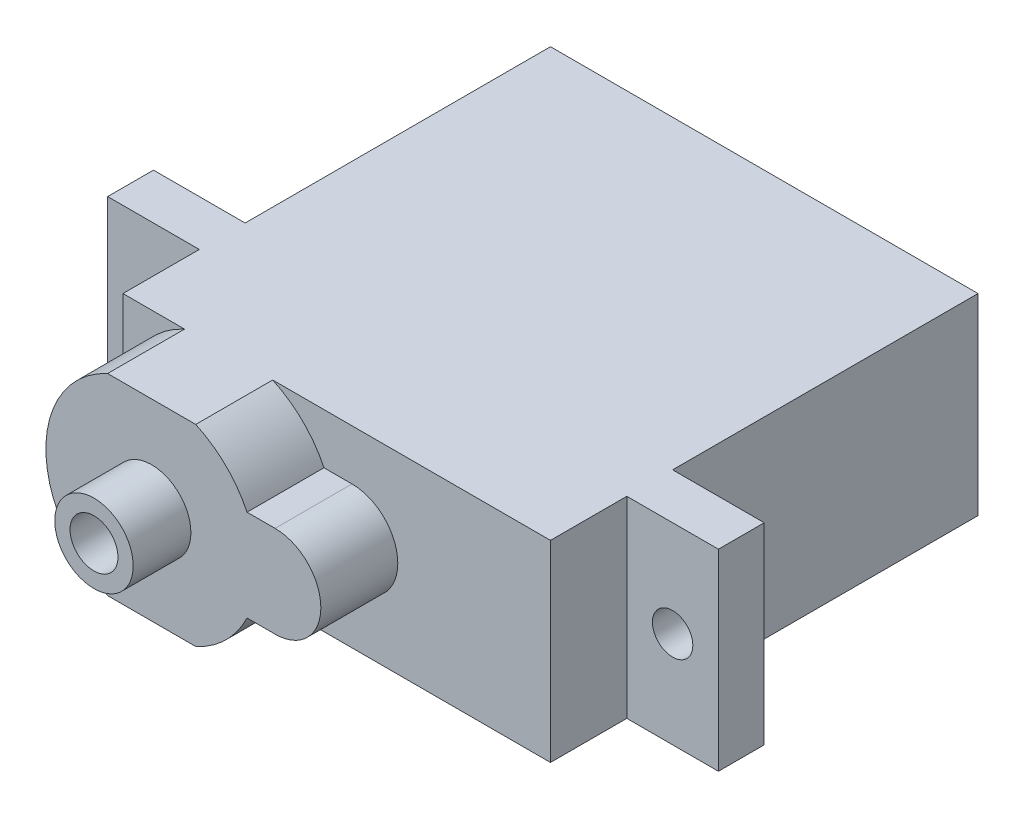
ISO-10303-21;
HEADER;
FILE_DESCRIPTION(('STEP AP214'),'2;1');
FILE_NAME('part.step','',(''),(''),'','','');
FILE_SCHEMA(('AUTOMOTIVE_DESIGN { 1 0 10303 214 1 1 1 1 }'));
ENDSEC;
DATA;
#1=APPLICATION_CONTEXT('core data for automotive mechanical design processes');
#2=APPLICATION_PROTOCOL_DEFINITION('international standard','automotive_design',2000,#1);
#3=PRODUCT_CONTEXT('',#1,'mechanical');
#4=PRODUCT('Part','Part','',(#3));
#5=PRODUCT_RELATED_PRODUCT_CATEGORY('part','',(#4));
#6=PRODUCT_DEFINITION_FORMATION('','',#4);
#7=PRODUCT_DEFINITION_CONTEXT('part definition',#1,'design');
#8=PRODUCT_DEFINITION('design','',#6,#7);
#9=PRODUCT_DEFINITION_SHAPE('','',#8);
#10=(LENGTH_UNIT() NAMED_UNIT(*) SI_UNIT(.MILLI.,.METRE.));
#11=(NAMED_UNIT(*) PLANE_ANGLE_UNIT() SI_UNIT($,.RADIAN.));
#12=(NAMED_UNIT(*) SI_UNIT($,.STERADIAN.) SOLID_ANGLE_UNIT());
#13=UNCERTAINTY_MEASURE_WITH_UNIT(LENGTH_MEASURE(1.E-05),#10,'distance_accuracy_value','');
#14=(GEOMETRIC_REPRESENTATION_CONTEXT(3) GLOBAL_UNCERTAINTY_ASSIGNED_CONTEXT((#13)) GLOBAL_UNIT_ASSIGNED_CONTEXT((#10,
#11,#12)) REPRESENTATION_CONTEXT('',''));
#15=CARTESIAN_POINT('',(0.,0.,0.));
#16=DIRECTION('',(0.,0.,1.));
#17=DIRECTION('',(1.,0.,0.));
#18=AXIS2_PLACEMENT_3D('',#15,#16,#17);
#19=CARTESIAN_POINT('',(1.15186357194197,-1.67093684812876E-06,122.982558594889));
#20=DIRECTION('',(0.,0.,1.));
#21=DIRECTION('',(1.,0.,0.));
#22=AXIS2_PLACEMENT_3D('',#19,#20,#21);
#23=PLANE('',#22);
#24=DIRECTION('',(-1.,0.,0.));
#25=VECTOR('',#24,1.);
#26=CARTESIAN_POINT('',(1.15186357194197,-19.0500541629293,122.982558594889));
#27=LINE('',#26,#25);
#28=CARTESIAN_POINT('',(9.23615171911756,-19.0500541629293,122.982558594889));
#29=VERTEX_POINT('',#28);
#30=CARTESIAN_POINT('',(-2.40171534908267,-19.0500541629293,122.982558594889));
#31=VERTEX_POINT('',#30);
#32=EDGE_CURVE('E200',#29,#31,#27,.T.);
#33=ORIENTED_EDGE('',*,*,#32,.F.);
#34=CARTESIAN_POINT('',(9.23615171911736,0.000292086948433482,122.982558594889));
#35=DIRECTION('',(0.,0.,1.));
#36=DIRECTION('',(1.,0.,0.));
#37=AXIS2_PLACEMENT_3D('',#34,#35,#36);
#38=CIRCLE('',#37,19.0503462459962);
#39=CARTESIAN_POINT('',(9.23669557194196,19.0506383290632,122.982558594889));
#40=VERTEX_POINT('',#39);
#41=EDGE_CURVE('E208',#29,#40,#38,.T.);
#42=ORIENTED_EDGE('',*,*,#41,.T.);
#43=DIRECTION('',(-1.,0.,0.));
#44=VECTOR('',#43,1.);
#45=CARTESIAN_POINT('',(1.15186357194197,19.0506383290632,122.982558594889));
#46=LINE('',#45,#44);
#47=CARTESIAN_POINT('',(-2.40199753846205,19.0506383290632,122.982558594889));
#48=VERTEX_POINT('',#47);
#49=EDGE_CURVE('E214',#40,#48,#46,.T.);
#50=ORIENTED_EDGE('',*,*,#49,.T.);
#51=CARTESIAN_POINT('',(-42.0639833131355,-1.67093684812876E-06,122.982558594889));
#52=DIRECTION('',(0.,0.,1.));
#53=DIRECTION('',(1.,0.,0.));
#54=AXIS2_PLACEMENT_3D('',#51,#52,#53);
#55=CIRCLE('',#54,44.);
#56=CARTESIAN_POINT('',(-23.7336805333122,39.9999983290632,122.982558594889));
#57=VERTEX_POINT('',#56);
#58=EDGE_CURVE('E233',#48,#57,#55,.T.);
#59=ORIENTED_EDGE('',*,*,#58,.T.);
#60=DIRECTION('',(-1.,0.,0.));
#61=VECTOR('',#60,1.);
#62=CARTESIAN_POINT('',(1.15186357194197,39.9999983290632,122.982558594889));
#63=LINE('',#62,#61);
#64=CARTESIAN_POINT('',(-60.3942860929589,39.9999983290632,122.982558594889));
#65=VERTEX_POINT('',#64);
#66=EDGE_CURVE('E236',#57,#65,#63,.T.);
#67=ORIENTED_EDGE('',*,*,#66,.T.);
#68=CARTESIAN_POINT('',(-86.013336428058,2.11053399089171,122.982558594889));
#69=VERTEX_POINT('',#68);
#70=EDGE_CURVE('E237',#65,#69,#55,.T.);
#71=ORIENTED_EDGE('',*,*,#70,.T.);
#72=DIRECTION('',(0.,-1.,0.));
#73=VECTOR('',#72,1.);
#74=CARTESIAN_POINT('',(-86.013336428058,-1.67093684812876E-06,122.982558594889));
#75=LINE('',#74,#73);
#76=CARTESIAN_POINT('',(-86.013336428058,-2.1105373327654,122.982558594889));
#77=VERTEX_POINT('',#76);
#78=EDGE_CURVE('E240',#69,#77,#75,.T.);
#79=ORIENTED_EDGE('',*,*,#78,.T.);
#80=CARTESIAN_POINT('',(-60.3942860929589,-40.0000016709368,122.982558594889));
#81=VERTEX_POINT('',#80);
#82=EDGE_CURVE('E243',#77,#81,#55,.T.);
#83=ORIENTED_EDGE('',*,*,#82,.T.);
#84=DIRECTION('',(1.,0.,0.));
#85=VECTOR('',#84,1.);
#86=CARTESIAN_POINT('',(1.15186357194197,-40.0000016709368,122.982558594889));
#87=LINE('',#86,#85);
#88=CARTESIAN_POINT('',(-23.7336805333122,-40.0000016709368,122.982558594889));
#89=VERTEX_POINT('',#88);
#90=EDGE_CURVE('E244',#81,#89,#87,.T.);
#91=ORIENTED_EDGE('',*,*,#90,.T.);
#92=EDGE_CURVE('E218',#89,#31,#55,.T.);
#93=ORIENTED_EDGE('',*,*,#92,.T.);
#94=EDGE_LOOP('',(#33,#42,#50,#59,#67,#71,#79,#83,#91,#93));
#95=FACE_BOUND('',#94,.T.);
#96=CARTESIAN_POINT('',(-42.0639833131355,-1.67093684812876E-06,122.982558594889));
#97=DIRECTION('',(0.,0.,1.));
#98=DIRECTION('',(1.,0.,0.));
#99=AXIS2_PLACEMENT_3D('',#96,#97,#98);
#100=CIRCLE('',#99,16.3106998418424);
#101=CARTESIAN_POINT('',(-25.7532834712931,-1.67093684812876E-06,122.982558594889));
#102=VERTEX_POINT('',#101);
#103=EDGE_CURVE('E228',#102,#102,#100,.T.);
#104=ORIENTED_EDGE('',*,*,#103,.F.);
#105=EDGE_LOOP('',(#104));
#106=FACE_BOUND('',#105,.T.);
#107=ADVANCED_FACE('F47',(#95,#106),#23,.T.);
#108=CARTESIAN_POINT('',(91.786663571942,39.9999983290632,90.9825585948885));
#109=DIRECTION('',(0.,0.,-1.));
#110=DIRECTION('',(-1.,0.,0.));
#111=AXIS2_PLACEMENT_3D('',#108,#109,#110);
#112=PLANE('',#111);
#113=CARTESIAN_POINT('',(-42.0639833131355,-1.67093684812876E-06,90.9825585948885));
#114=DIRECTION('',(0.,0.,1.));
#115=DIRECTION('',(1.,0.,0.));
#116=AXIS2_PLACEMENT_3D('',#113,#114,#115);
#117=CIRCLE('',#116,44.);
#118=CARTESIAN_POINT('',(-86.013336428058,-2.1105373327654,90.9825585948885));
#119=VERTEX_POINT('',#118);
#120=CARTESIAN_POINT('',(-60.3942860929589,-40.0000016709368,90.9825585948885));
#121=VERTEX_POINT('',#120);
#122=EDGE_CURVE('E225',#119,#121,#117,.T.);
#123=ORIENTED_EDGE('',*,*,#122,.F.);
#124=DIRECTION('',(0.,-1.,0.));
#125=VECTOR('',#124,1.);
#126=CARTESIAN_POINT('',(-86.013336428058,39.9999983290632,90.9825585948885));
#127=LINE('',#126,#125);
#128=CARTESIAN_POINT('',(-86.013336428058,-40.0000016709368,90.9825585948885));
#129=VERTEX_POINT('',#128);
#130=EDGE_CURVE('E400',#119,#129,#127,.T.);
#131=ORIENTED_EDGE('',*,*,#130,.T.);
#132=DIRECTION('',(1.,0.,0.));
#133=VECTOR('',#132,1.);
#134=CARTESIAN_POINT('',(91.786663571942,-40.0000016709368,90.9825585948885));
#135=LINE('',#134,#133);
#136=EDGE_CURVE('E360',#129,#121,#135,.T.);
#137=ORIENTED_EDGE('',*,*,#136,.T.);
#138=EDGE_LOOP('',(#123,#131,#137));
#139=FACE_BOUND('',#138,.T.);
#140=ADVANCED_FACE('F418',(#139),#112,.F.);
#141=CARTESIAN_POINT('',(-60.3942860929589,39.9999983290632,90.9825585948885));
#142=VERTEX_POINT('',#141);
#143=CARTESIAN_POINT('',(-86.013336428058,2.11053399089171,90.9825585948885));
#144=VERTEX_POINT('',#143);
#145=EDGE_CURVE('E274',#142,#144,#117,.T.);
#146=ORIENTED_EDGE('',*,*,#145,.F.);
#147=DIRECTION('',(1.,0.,0.));
#148=VECTOR('',#147,1.);
#149=CARTESIAN_POINT('',(91.786663571942,39.9999983290632,90.9825585948885));
#150=LINE('',#149,#148);
#151=CARTESIAN_POINT('',(-86.013336428058,39.9999983290632,90.9825585948885));
#152=VERTEX_POINT('',#151);
#153=EDGE_CURVE('E352',#152,#142,#150,.T.);
#154=ORIENTED_EDGE('',*,*,#153,.F.);
#155=EDGE_CURVE('E406',#152,#144,#127,.T.);
#156=ORIENTED_EDGE('',*,*,#155,.T.);
#157=EDGE_LOOP('',(#146,#154,#156));
#158=FACE_BOUND('',#157,.T.);
#159=ADVANCED_FACE('F523',(#158),#112,.F.);
#160=CARTESIAN_POINT('',(-23.7336805333122,-40.0000016709368,90.9825585948885));
#161=VERTEX_POINT('',#160);
#162=CARTESIAN_POINT('',(-2.40171534908267,-19.0500541629293,90.9825585948885));
#163=VERTEX_POINT('',#162);
#164=EDGE_CURVE('E221',#161,#163,#117,.T.);
#165=ORIENTED_EDGE('',*,*,#164,.F.);
#166=CARTESIAN_POINT('',(91.786663571942,-40.0000016709368,90.9825585948885));
#167=VERTEX_POINT('',#166);
#168=EDGE_CURVE('E356',#161,#167,#135,.T.);
#169=ORIENTED_EDGE('',*,*,#168,.T.);
#170=DIRECTION('',(0.,-1.,0.));
#171=VECTOR('',#170,1.);
#172=CARTESIAN_POINT('',(91.786663571942,39.9999983290632,90.9825585948885));
#173=LINE('',#172,#171);
#174=CARTESIAN_POINT('',(91.786663571942,39.9999983290632,90.9825585948885));
#175=VERTEX_POINT('',#174);
#176=EDGE_CURVE('E396',#175,#167,#173,.T.);
#177=ORIENTED_EDGE('',*,*,#176,.F.);
#178=CARTESIAN_POINT('',(-23.7336805333122,39.9999983290632,90.9825585948885));
#179=VERTEX_POINT('',#178);
#180=EDGE_CURVE('E343',#179,#175,#150,.T.);
#181=ORIENTED_EDGE('',*,*,#180,.F.);
#182=CARTESIAN_POINT('',(-2.40199753846205,19.0506383290632,90.9825585948885));
#183=VERTEX_POINT('',#182);
#184=EDGE_CURVE('E70',#183,#179,#117,.T.);
#185=ORIENTED_EDGE('',*,*,#184,.F.);
#186=DIRECTION('',(-1.,0.,0.));
#187=VECTOR('',#186,1.);
#188=CARTESIAN_POINT('',(1.15186357194197,19.0506383290632,90.9825585948885));
#189=LINE('',#188,#187);
#190=CARTESIAN_POINT('',(9.23669557194196,19.0506383290632,90.9825585948885));
#191=VERTEX_POINT('',#190);
#192=EDGE_CURVE('E253',#191,#183,#189,.T.);
#193=ORIENTED_EDGE('',*,*,#192,.F.);
#194=CARTESIAN_POINT('',(9.23615171911736,0.000292086948433482,90.9825585948885));
#195=DIRECTION('',(0.,0.,1.));
#196=DIRECTION('',(1.,0.,0.));
#197=AXIS2_PLACEMENT_3D('',#194,#195,#196);
#198=CIRCLE('',#197,19.0503462459962);
#199=CARTESIAN_POINT('',(9.23615171911756,-19.0500541629293,90.9825585948885));
#200=VERTEX_POINT('',#199);
#201=EDGE_CURVE('E249',#200,#191,#198,.T.);
#202=ORIENTED_EDGE('',*,*,#201,.F.);
#203=DIRECTION('',(-1.,0.,0.));
#204=VECTOR('',#203,1.);
#205=CARTESIAN_POINT('',(1.15186357194197,-19.0500541629293,90.9825585948885));
#206=LINE('',#205,#204);
#207=EDGE_CURVE('E63',#200,#163,#206,.T.);
#208=ORIENTED_EDGE('',*,*,#207,.T.);
#209=EDGE_LOOP('',(#165,#169,#177,#181,#185,#193,#202,#208));
#210=FACE_BOUND('',#209,.T.);
#211=ADVANCED_FACE('F536',(#210),#112,.F.);
#212=CARTESIAN_POINT('',(91.786663571942,39.9999983290632,-86.8174414051115));
#213=DIRECTION('',(-1.,0.,0.));
#214=DIRECTION('',(0.,0.,1.));
#215=AXIS2_PLACEMENT_3D('',#212,#213,#214);
#216=PLANE('',#215);
#217=DIRECTION('',(0.,0.,-1.));
#218=VECTOR('',#217,1.);
#219=CARTESIAN_POINT('',(91.786663571942,-40.0000016709368,-86.8174414051115));
#220=LINE('',#219,#218);
#221=CARTESIAN_POINT('',(91.786663571942,-40.0000016709368,40.1825585948884));
#222=VERTEX_POINT('',#221);
#223=CARTESIAN_POINT('',(91.786663571942,-40.0000016709368,-86.8174414051115));
#224=VERTEX_POINT('',#223);
#225=EDGE_CURVE('E204',#222,#224,#220,.T.);
#226=ORIENTED_EDGE('',*,*,#225,.T.);
#227=DIRECTION('',(0.,-1.,0.));
#228=VECTOR('',#227,1.);
#229=CARTESIAN_POINT('',(91.786663571942,39.9999983290632,-86.8174414051115));
#230=LINE('',#229,#228);
#231=CARTESIAN_POINT('',(91.786663571942,39.9999983290632,-86.8174414051115));
#232=VERTEX_POINT('',#231);
#233=EDGE_CURVE('E56',#232,#224,#230,.T.);
#234=ORIENTED_EDGE('',*,*,#233,.F.);
#235=DIRECTION('',(0.,0.,-1.));
#236=VECTOR('',#235,1.);
#237=CARTESIAN_POINT('',(91.786663571942,39.9999983290632,-86.8174414051115));
#238=LINE('',#237,#236);
#239=CARTESIAN_POINT('',(91.786663571942,39.9999983290632,40.1825585948884));
#240=VERTEX_POINT('',#239);
#241=EDGE_CURVE('E320',#240,#232,#238,.T.);
#242=ORIENTED_EDGE('',*,*,#241,.F.);
#243=DIRECTION('',(0.,-1.,0.));
#244=VECTOR('',#243,1.);
#245=CARTESIAN_POINT('',(91.786663571942,39.9999983290632,40.1825585948884));
#246=LINE('',#245,#244);
#247=EDGE_CURVE('E379',#240,#222,#246,.T.);
#248=ORIENTED_EDGE('',*,*,#247,.T.);
#249=EDGE_LOOP('',(#226,#234,#242,#248));
#250=FACE_BOUND('',#249,.T.);
#251=ADVANCED_FACE('F49',(#250),#216,.F.);
#252=CARTESIAN_POINT('',(-86.013336428058,39.9999983290632,-86.8174414051115));
#253=DIRECTION('',(0.,0.,1.));
#254=DIRECTION('',(1.,0.,0.));
#255=AXIS2_PLACEMENT_3D('',#252,#253,#254);
#256=PLANE('',#255);
#257=DIRECTION('',(-1.,0.,0.));
#258=VECTOR('',#257,1.);
#259=CARTESIAN_POINT('',(-86.013336428058,-40.0000016709368,-86.8174414051115));
#260=LINE('',#259,#258);
#261=CARTESIAN_POINT('',(-86.013336428058,-40.0000016709368,-86.8174414051115));
#262=VERTEX_POINT('',#261);
#263=EDGE_CURVE('E445',#224,#262,#260,.T.);
#264=ORIENTED_EDGE('',*,*,#263,.T.);
#265=DIRECTION('',(0.,-1.,0.));
#266=VECTOR('',#265,1.);
#267=CARTESIAN_POINT('',(-86.013336428058,39.9999983290632,-86.8174414051115));
#268=LINE('',#267,#266);
#269=CARTESIAN_POINT('',(-86.013336428058,39.9999983290632,-86.8174414051115));
#270=VERTEX_POINT('',#269);
#271=EDGE_CURVE('E487',#270,#262,#268,.T.);
#272=ORIENTED_EDGE('',*,*,#271,.F.);
#273=DIRECTION('',(-1.,0.,0.));
#274=VECTOR('',#273,1.);
#275=CARTESIAN_POINT('',(-86.013336428058,39.9999983290632,-86.8174414051115));
#276=LINE('',#275,#274);
#277=EDGE_CURVE('E324',#232,#270,#276,.T.);
#278=ORIENTED_EDGE('',*,*,#277,.F.);
#279=ORIENTED_EDGE('',*,*,#233,.T.);
#280=EDGE_LOOP('',(#264,#272,#278,#279));
#281=FACE_BOUND('',#280,.T.);
#282=ADVANCED_FACE('F520',(#281),#256,.F.);
#283=CARTESIAN_POINT('',(-86.013336428058,39.9999983290632,40.1825585948885));
#284=DIRECTION('',(1.,0.,0.));
#285=DIRECTION('',(0.,0.,-1.));
#286=AXIS2_PLACEMENT_3D('',#283,#284,#285);
#287=PLANE('',#286);
#288=DIRECTION('',(0.,0.,1.));
#289=VECTOR('',#288,1.);
#290=CARTESIAN_POINT('',(-86.013336428058,-40.0000016709368,40.1825585948885));
#291=LINE('',#290,#289);
#292=CARTESIAN_POINT('',(-86.013336428058,-40.0000016709368,40.1825585948885));
#293=VERTEX_POINT('',#292);
#294=EDGE_CURVE('E442',#262,#293,#291,.T.);
#295=ORIENTED_EDGE('',*,*,#294,.T.);
#296=DIRECTION('',(0.,-1.,0.));
#297=VECTOR('',#296,1.);
#298=CARTESIAN_POINT('',(-86.013336428058,39.9999983290632,40.1825585948885));
#299=LINE('',#298,#297);
#300=CARTESIAN_POINT('',(-86.013336428058,39.9999983290632,40.1825585948885));
#301=VERTEX_POINT('',#300);
#302=EDGE_CURVE('E490',#301,#293,#299,.T.);
#303=ORIENTED_EDGE('',*,*,#302,.F.);
#304=DIRECTION('',(0.,0.,1.));
#305=VECTOR('',#304,1.);
#306=CARTESIAN_POINT('',(-86.013336428058,39.9999983290632,40.1825585948885));
#307=LINE('',#306,#305);
#308=EDGE_CURVE('E328',#270,#301,#307,.T.);
#309=ORIENTED_EDGE('',*,*,#308,.F.);
#310=ORIENTED_EDGE('',*,*,#271,.T.);
#311=EDGE_LOOP('',(#295,#303,#309,#310));
#312=FACE_BOUND('',#311,.T.);
#313=ADVANCED_FACE('F518',(#312),#287,.F.);
#314=CARTESIAN_POINT('',(-124.113336428058,39.9999983290632,40.1825585948885));
#315=DIRECTION('',(0.,0.,1.));
#316=DIRECTION('',(1.,0.,0.));
#317=AXIS2_PLACEMENT_3D('',#314,#315,#316);
#318=PLANE('',#317);
#319=CARTESIAN_POINT('',(-105.06363684376,0.000466795578882427,40.1825585948885));
#320=DIRECTION('',(0.,0.,1.));
#321=DIRECTION('',(1.,0.,0.));
#322=AXIS2_PLACEMENT_3D('',#319,#320,#321);
#323=CIRCLE('',#322,8.4);
#324=CARTESIAN_POINT('',(-96.6636368437603,0.000466795578882427,40.1825585948885));
#325=VERTEX_POINT('',#324);
#326=EDGE_CURVE('E548',#325,#325,#323,.F.);
#327=ORIENTED_EDGE('',*,*,#326,.F.);
#328=EDGE_LOOP('',(#327));
#329=FACE_BOUND('',#328,.T.);
#330=DIRECTION('',(-1.,0.,0.));
#331=VECTOR('',#330,1.);
#332=CARTESIAN_POINT('',(-124.113336428058,-40.0000016709368,40.1825585948885));
#333=LINE('',#332,#331);
#334=CARTESIAN_POINT('',(-124.113336428058,-40.0000016709368,40.1825585948885));
#335=VERTEX_POINT('',#334);
#336=EDGE_CURVE('E439',#293,#335,#333,.T.);
#337=ORIENTED_EDGE('',*,*,#336,.T.);
#338=DIRECTION('',(0.,-1.,0.));
#339=VECTOR('',#338,1.);
#340=CARTESIAN_POINT('',(-124.113336428058,39.9999983290632,40.1825585948885));
#341=LINE('',#340,#339);
#342=CARTESIAN_POINT('',(-124.113336428058,39.9999983290632,40.1825585948885));
#343=VERTEX_POINT('',#342);
#344=EDGE_CURVE('E496',#343,#335,#341,.T.);
#345=ORIENTED_EDGE('',*,*,#344,.F.);
#346=DIRECTION('',(-1.,0.,0.));
#347=VECTOR('',#346,1.);
#348=CARTESIAN_POINT('',(-124.113336428058,39.9999983290632,40.1825585948885));
#349=LINE('',#348,#347);
#350=EDGE_CURVE('E331',#301,#343,#349,.T.);
#351=ORIENTED_EDGE('',*,*,#350,.F.);
#352=ORIENTED_EDGE('',*,*,#302,.T.);
#353=EDGE_LOOP('',(#337,#345,#351,#352));
#354=FACE_BOUND('',#353,.T.);
#355=ADVANCED_FACE('F514',(#329,#354),#318,.F.);
#356=CARTESIAN_POINT('',(-124.113336428058,39.9999983290632,59.2325585948885));
#357=DIRECTION('',(1.,0.,0.));
#358=DIRECTION('',(0.,0.,-1.));
#359=AXIS2_PLACEMENT_3D('',#356,#357,#358);
#360=PLANE('',#359);
#361=DIRECTION('',(0.,0.,1.));
#362=VECTOR('',#361,1.);
#363=CARTESIAN_POINT('',(-124.113336428058,-40.0000016709368,59.2325585948885));
#364=LINE('',#363,#362);
#365=CARTESIAN_POINT('',(-124.113336428058,-40.0000016709368,59.2325585948885));
#366=VERTEX_POINT('',#365);
#367=EDGE_CURVE('E437',#335,#366,#364,.T.);
#368=ORIENTED_EDGE('',*,*,#367,.T.);
#369=DIRECTION('',(0.,-1.,0.));
#370=VECTOR('',#369,1.);
#371=CARTESIAN_POINT('',(-124.113336428058,39.9999983290632,59.2325585948885));
#372=LINE('',#371,#370);
#373=CARTESIAN_POINT('',(-124.113336428058,39.9999983290632,59.2325585948885));
#374=VERTEX_POINT('',#373);
#375=EDGE_CURVE('E414',#374,#366,#372,.T.);
#376=ORIENTED_EDGE('',*,*,#375,.F.);
#377=DIRECTION('',(0.,0.,1.));
#378=VECTOR('',#377,1.);
#379=CARTESIAN_POINT('',(-124.113336428058,39.9999983290632,59.2325585948885));
#380=LINE('',#379,#378);
#381=EDGE_CURVE('E334',#343,#374,#380,.T.);
#382=ORIENTED_EDGE('',*,*,#381,.F.);
#383=ORIENTED_EDGE('',*,*,#344,.T.);
#384=EDGE_LOOP('',(#368,#376,#382,#383));
#385=FACE_BOUND('',#384,.T.);
#386=ADVANCED_FACE('F510',(#385),#360,.F.);
#387=CARTESIAN_POINT('',(-86.013336428058,39.9999983290632,59.2325585948885));
#388=DIRECTION('',(0.,0.,-1.));
#389=DIRECTION('',(-1.,0.,0.));
#390=AXIS2_PLACEMENT_3D('',#387,#388,#389);
#391=PLANE('',#390);
#392=CARTESIAN_POINT('',(-105.06363684376,0.000466795578882427,59.2325585948885));
#393=DIRECTION('',(0.,0.,1.));
#394=DIRECTION('',(1.,0.,0.));
#395=AXIS2_PLACEMENT_3D('',#392,#393,#394);
#396=CIRCLE('',#395,8.4);
#397=CARTESIAN_POINT('',(-96.6636368437603,0.000466795578882427,59.2325585948885));
#398=VERTEX_POINT('',#397);
#399=EDGE_CURVE('E552',#398,#398,#396,.T.);
#400=ORIENTED_EDGE('',*,*,#399,.F.);
#401=EDGE_LOOP('',(#400));
#402=FACE_BOUND('',#401,.T.);
#403=DIRECTION('',(1.,0.,0.));
#404=VECTOR('',#403,1.);
#405=CARTESIAN_POINT('',(-86.013336428058,-40.0000016709368,59.2325585948885));
#406=LINE('',#405,#404);
#407=CARTESIAN_POINT('',(-86.013336428058,-40.0000016709368,59.2325585948885));
#408=VERTEX_POINT('',#407);
#409=EDGE_CURVE('E429',#366,#408,#406,.T.);
#410=ORIENTED_EDGE('',*,*,#409,.T.);
#411=DIRECTION('',(0.,-1.,0.));
#412=VECTOR('',#411,1.);
#413=CARTESIAN_POINT('',(-86.013336428058,39.9999983290632,59.2325585948885));
#414=LINE('',#413,#412);
#415=CARTESIAN_POINT('',(-86.013336428058,39.9999983290632,59.2325585948885));
#416=VERTEX_POINT('',#415);
#417=EDGE_CURVE('E403',#416,#408,#414,.T.);
#418=ORIENTED_EDGE('',*,*,#417,.F.);
#419=DIRECTION('',(1.,0.,0.));
#420=VECTOR('',#419,1.);
#421=CARTESIAN_POINT('',(-86.013336428058,39.9999983290632,59.2325585948885));
#422=LINE('',#421,#420);
#423=EDGE_CURVE('E337',#374,#416,#422,.T.);
#424=ORIENTED_EDGE('',*,*,#423,.F.);
#425=ORIENTED_EDGE('',*,*,#375,.T.);
#426=EDGE_LOOP('',(#410,#418,#424,#425));
#427=FACE_BOUND('',#426,.T.);
#428=ADVANCED_FACE('F504',(#402,#427),#391,.F.);
#429=CARTESIAN_POINT('',(-86.013336428058,39.9999983290632,90.9825585948885));
#430=DIRECTION('',(1.,0.,0.));
#431=DIRECTION('',(0.,0.,-1.));
#432=AXIS2_PLACEMENT_3D('',#429,#430,#431);
#433=PLANE('',#432);
#434=DIRECTION('',(0.,0.,1.));
#435=VECTOR('',#434,1.);
#436=CARTESIAN_POINT('',(-86.013336428058,-40.0000016709368,90.9825585948885));
#437=LINE('',#436,#435);
#438=EDGE_CURVE('E361',#408,#129,#437,.T.);
#439=ORIENTED_EDGE('',*,*,#438,.T.);
#440=ORIENTED_EDGE('',*,*,#130,.F.);
#441=DIRECTION('',(0.,0.,-1.));
#442=VECTOR('',#441,1.);
#443=CARTESIAN_POINT('',(-86.013336428058,-2.1105373327654,122.982558594889));
#444=LINE('',#443,#442);
#445=EDGE_CURVE('E280',#77,#119,#444,.T.);
#446=ORIENTED_EDGE('',*,*,#445,.F.);
#447=ORIENTED_EDGE('',*,*,#78,.F.);
#448=DIRECTION('',(0.,0.,-1.));
#449=VECTOR('',#448,1.);
#450=CARTESIAN_POINT('',(-86.013336428058,2.11053399089171,122.982558594889));
#451=LINE('',#450,#449);
#452=EDGE_CURVE('E287',#69,#144,#451,.T.);
#453=ORIENTED_EDGE('',*,*,#452,.T.);
#454=ORIENTED_EDGE('',*,*,#155,.F.);
#455=DIRECTION('',(0.,0.,1.));
#456=VECTOR('',#455,1.);
#457=CARTESIAN_POINT('',(-86.013336428058,39.9999983290632,90.9825585948885));
#458=LINE('',#457,#456);
#459=EDGE_CURVE('E340',#416,#152,#458,.T.);
#460=ORIENTED_EDGE('',*,*,#459,.F.);
#461=ORIENTED_EDGE('',*,*,#417,.T.);
#462=EDGE_LOOP('',(#439,#440,#446,#447,#453,#454,#460,#461));
#463=FACE_BOUND('',#462,.T.);
#464=ADVANCED_FACE('F423',(#463),#433,.F.);
#465=CARTESIAN_POINT('',(91.786663571942,39.9999983290632,59.2325585948885));
#466=DIRECTION('',(-1.,0.,0.));
#467=DIRECTION('',(0.,0.,1.));
#468=AXIS2_PLACEMENT_3D('',#465,#466,#467);
#469=PLANE('',#468);
#470=DIRECTION('',(0.,0.,-1.));
#471=VECTOR('',#470,1.);
#472=CARTESIAN_POINT('',(91.786663571942,-40.0000016709368,59.2325585948885));
#473=LINE('',#472,#471);
#474=CARTESIAN_POINT('',(91.786663571942,-40.0000016709368,59.2325585948885));
#475=VERTEX_POINT('',#474);
#476=EDGE_CURVE('E367',#167,#475,#473,.T.);
#477=ORIENTED_EDGE('',*,*,#476,.T.);
#478=DIRECTION('',(0.,-1.,0.));
#479=VECTOR('',#478,1.);
#480=CARTESIAN_POINT('',(91.786663571942,39.9999983290632,59.2325585948885));
#481=LINE('',#480,#479);
#482=CARTESIAN_POINT('',(91.786663571942,39.9999983290632,59.2325585948885));
#483=VERTEX_POINT('',#482);
#484=EDGE_CURVE('E392',#483,#475,#481,.T.);
#485=ORIENTED_EDGE('',*,*,#484,.F.);
#486=DIRECTION('',(0.,0.,-1.));
#487=VECTOR('',#486,1.);
#488=CARTESIAN_POINT('',(91.786663571942,39.9999983290632,59.2325585948885));
#489=LINE('',#488,#487);
#490=EDGE_CURVE('E346',#175,#483,#489,.T.);
#491=ORIENTED_EDGE('',*,*,#490,.F.);
#492=ORIENTED_EDGE('',*,*,#176,.T.);
#493=EDGE_LOOP('',(#477,#485,#491,#492));
#494=FACE_BOUND('',#493,.T.);
#495=ADVANCED_FACE('F468',(#494),#469,.F.);
#496=CARTESIAN_POINT('',(129.886663571942,39.9999983290632,59.2325585948885));
#497=DIRECTION('',(0.,0.,-1.));
#498=DIRECTION('',(-1.,0.,0.));
#499=AXIS2_PLACEMENT_3D('',#496,#497,#498);
#500=PLANE('',#499);
#501=CARTESIAN_POINT('',(110.836156215017,0.000489650266029676,59.2325585948885));
#502=DIRECTION('',(0.,0.,1.));
#503=DIRECTION('',(1.,0.,0.));
#504=AXIS2_PLACEMENT_3D('',#501,#502,#503);
#505=CIRCLE('',#504,8.39999999999996);
#506=CARTESIAN_POINT('',(119.236156215017,0.000489650266029676,59.2325585948885));
#507=VERTEX_POINT('',#506);
#508=EDGE_CURVE('E560',#507,#507,#505,.T.);
#509=ORIENTED_EDGE('',*,*,#508,.F.);
#510=EDGE_LOOP('',(#509));
#511=FACE_BOUND('',#510,.T.);
#512=DIRECTION('',(1.,0.,0.));
#513=VECTOR('',#512,1.);
#514=CARTESIAN_POINT('',(129.886663571942,-40.0000016709368,59.2325585948885));
#515=LINE('',#514,#513);
#516=CARTESIAN_POINT('',(129.886663571942,-40.0000016709368,59.2325585948885));
#517=VERTEX_POINT('',#516);
#518=EDGE_CURVE('E371',#475,#517,#515,.T.);
#519=ORIENTED_EDGE('',*,*,#518,.T.);
#520=DIRECTION('',(0.,-1.,0.));
#521=VECTOR('',#520,1.);
#522=CARTESIAN_POINT('',(129.886663571942,39.9999983290632,59.2325585948885));
#523=LINE('',#522,#521);
#524=CARTESIAN_POINT('',(129.886663571942,39.9999983290632,59.2325585948885));
#525=VERTEX_POINT('',#524);
#526=EDGE_CURVE('E388',#525,#517,#523,.T.);
#527=ORIENTED_EDGE('',*,*,#526,.F.);
#528=DIRECTION('',(1.,0.,0.));
#529=VECTOR('',#528,1.);
#530=CARTESIAN_POINT('',(129.886663571942,39.9999983290632,59.2325585948885));
#531=LINE('',#530,#529);
#532=EDGE_CURVE('E458',#483,#525,#531,.T.);
#533=ORIENTED_EDGE('',*,*,#532,.F.);
#534=ORIENTED_EDGE('',*,*,#484,.T.);
#535=EDGE_LOOP('',(#519,#527,#533,#534));
#536=FACE_BOUND('',#535,.T.);
#537=ADVANCED_FACE('F472',(#511,#536),#500,.F.);
#538=CARTESIAN_POINT('',(129.886663571942,39.9999983290632,40.1825585948885));
#539=DIRECTION('',(-1.,0.,0.));
#540=DIRECTION('',(0.,0.,1.));
#541=AXIS2_PLACEMENT_3D('',#538,#539,#540);
#542=PLANE('',#541);
#543=DIRECTION('',(0.,0.,-1.));
#544=VECTOR('',#543,1.);
#545=CARTESIAN_POINT('',(129.886663571942,-40.0000016709368,40.1825585948885));
#546=LINE('',#545,#544);
#547=CARTESIAN_POINT('',(129.886663571942,-40.0000016709368,40.1825585948885));
#548=VERTEX_POINT('',#547);
#549=EDGE_CURVE('E374',#517,#548,#546,.T.);
#550=ORIENTED_EDGE('',*,*,#549,.T.);
#551=DIRECTION('',(0.,-1.,0.));
#552=VECTOR('',#551,1.);
#553=CARTESIAN_POINT('',(129.886663571942,39.9999983290632,40.1825585948885));
#554=LINE('',#553,#552);
#555=CARTESIAN_POINT('',(129.886663571942,39.9999983290632,40.1825585948885));
#556=VERTEX_POINT('',#555);
#557=EDGE_CURVE('E383',#556,#548,#554,.T.);
#558=ORIENTED_EDGE('',*,*,#557,.F.);
#559=DIRECTION('',(0.,0.,-1.));
#560=VECTOR('',#559,1.);
#561=CARTESIAN_POINT('',(129.886663571942,39.9999983290632,40.1825585948885));
#562=LINE('',#561,#560);
#563=EDGE_CURVE('E456',#525,#556,#562,.T.);
#564=ORIENTED_EDGE('',*,*,#563,.F.);
#565=ORIENTED_EDGE('',*,*,#526,.T.);
#566=EDGE_LOOP('',(#550,#558,#564,#565));
#567=FACE_BOUND('',#566,.T.);
#568=ADVANCED_FACE('F477',(#567),#542,.F.);
#569=CARTESIAN_POINT('',(91.786663571942,39.9999983290632,40.1825585948884));
#570=DIRECTION('',(0.,0.,1.));
#571=DIRECTION('',(1.,0.,0.));
#572=AXIS2_PLACEMENT_3D('',#569,#570,#571);
#573=PLANE('',#572);
#574=CARTESIAN_POINT('',(110.836156215017,0.000489650266029676,40.1825585948885));
#575=DIRECTION('',(0.,0.,1.));
#576=DIRECTION('',(1.,0.,0.));
#577=AXIS2_PLACEMENT_3D('',#574,#575,#576);
#578=CIRCLE('',#577,8.39999999999996);
#579=CARTESIAN_POINT('',(119.236156215017,0.000489650266029676,40.1825585948885));
#580=VERTEX_POINT('',#579);
#581=EDGE_CURVE('E556',#580,#580,#578,.F.);
#582=ORIENTED_EDGE('',*,*,#581,.F.);
#583=EDGE_LOOP('',(#582));
#584=FACE_BOUND('',#583,.T.);
#585=DIRECTION('',(-1.,0.,0.));
#586=VECTOR('',#585,1.);
#587=CARTESIAN_POINT('',(91.786663571942,-40.0000016709368,40.1825585948884));
#588=LINE('',#587,#586);
#589=EDGE_CURVE('E325',#548,#222,#588,.T.);
#590=ORIENTED_EDGE('',*,*,#589,.T.);
#591=ORIENTED_EDGE('',*,*,#247,.F.);
#592=DIRECTION('',(-1.,0.,0.));
#593=VECTOR('',#592,1.);
#594=CARTESIAN_POINT('',(91.786663571942,39.9999983290632,40.1825585948884));
#595=LINE('',#594,#593);
#596=EDGE_CURVE('E384',#556,#240,#595,.T.);
#597=ORIENTED_EDGE('',*,*,#596,.F.);
#598=ORIENTED_EDGE('',*,*,#557,.T.);
#599=EDGE_LOOP('',(#590,#591,#597,#598));
#600=FACE_BOUND('',#599,.T.);
#601=ADVANCED_FACE('F482',(#584,#600),#573,.F.);
#602=CARTESIAN_POINT('',(1.15186357194197,39.9999983290632,-86.8174414051115));
#603=DIRECTION('',(0.,1.,0.));
#604=DIRECTION('',(0.,0.,1.));
#605=AXIS2_PLACEMENT_3D('',#602,#603,#604);
#606=PLANE('',#605);
#607=ORIENTED_EDGE('',*,*,#241,.T.);
#608=ORIENTED_EDGE('',*,*,#277,.T.);
#609=ORIENTED_EDGE('',*,*,#308,.T.);
#610=ORIENTED_EDGE('',*,*,#350,.T.);
#611=ORIENTED_EDGE('',*,*,#381,.T.);
#612=ORIENTED_EDGE('',*,*,#423,.T.);
#613=ORIENTED_EDGE('',*,*,#459,.T.);
#614=ORIENTED_EDGE('',*,*,#153,.T.);
#615=DIRECTION('',(0.,0.,-1.));
#616=VECTOR('',#615,1.);
#617=CARTESIAN_POINT('',(-60.3942860929589,39.9999983290632,122.982558594889));
#618=LINE('',#617,#616);
#619=EDGE_CURVE('E295',#65,#142,#618,.T.);
#620=ORIENTED_EDGE('',*,*,#619,.F.);
#621=ORIENTED_EDGE('',*,*,#66,.F.);
#622=DIRECTION('',(0.,0.,-1.));
#623=VECTOR('',#622,1.);
#624=CARTESIAN_POINT('',(-23.7336805333122,39.9999983290632,122.982558594889));
#625=LINE('',#624,#623);
#626=EDGE_CURVE('E300',#57,#179,#625,.T.);
#627=ORIENTED_EDGE('',*,*,#626,.T.);
#628=ORIENTED_EDGE('',*,*,#180,.T.);
#629=ORIENTED_EDGE('',*,*,#490,.T.);
#630=ORIENTED_EDGE('',*,*,#532,.T.);
#631=ORIENTED_EDGE('',*,*,#563,.T.);
#632=ORIENTED_EDGE('',*,*,#596,.T.);
#633=EDGE_LOOP('',(#607,#608,#609,#610,#611,#612,#613,#614,#620,#621,#627,#628,#629,#630,#631,#632));
#634=FACE_BOUND('',#633,.T.);
#635=ADVANCED_FACE('F465',(#634),#606,.T.);
#636=CARTESIAN_POINT('',(1.15186357194197,-40.0000016709368,-86.8174414051115));
#637=DIRECTION('',(0.,1.,0.));
#638=DIRECTION('',(0.,0.,1.));
#639=AXIS2_PLACEMENT_3D('',#636,#637,#638);
#640=PLANE('',#639);
#641=ORIENTED_EDGE('',*,*,#225,.F.);
#642=ORIENTED_EDGE('',*,*,#589,.F.);
#643=ORIENTED_EDGE('',*,*,#549,.F.);
#644=ORIENTED_EDGE('',*,*,#518,.F.);
#645=ORIENTED_EDGE('',*,*,#476,.F.);
#646=ORIENTED_EDGE('',*,*,#168,.F.);
#647=DIRECTION('',(0.,0.,-1.));
#648=VECTOR('',#647,1.);
#649=CARTESIAN_POINT('',(-23.7336805333122,-40.0000016709368,122.982558594889));
#650=LINE('',#649,#648);
#651=EDGE_CURVE('E281',#89,#161,#650,.T.);
#652=ORIENTED_EDGE('',*,*,#651,.F.);
#653=ORIENTED_EDGE('',*,*,#90,.F.);
#654=DIRECTION('',(0.,0.,-1.));
#655=VECTOR('',#654,1.);
#656=CARTESIAN_POINT('',(-60.3942860929589,-40.0000016709368,122.982558594889));
#657=LINE('',#656,#655);
#658=EDGE_CURVE('E276',#81,#121,#657,.T.);
#659=ORIENTED_EDGE('',*,*,#658,.T.);
#660=ORIENTED_EDGE('',*,*,#136,.F.);
#661=ORIENTED_EDGE('',*,*,#438,.F.);
#662=ORIENTED_EDGE('',*,*,#409,.F.);
#663=ORIENTED_EDGE('',*,*,#367,.F.);
#664=ORIENTED_EDGE('',*,*,#336,.F.);
#665=ORIENTED_EDGE('',*,*,#294,.F.);
#666=ORIENTED_EDGE('',*,*,#263,.F.);
#667=EDGE_LOOP('',(#641,#642,#643,#644,#645,#646,#652,#653,#659,#660,#661,#662,#663,#664,#665,#666));
#668=FACE_BOUND('',#667,.T.);
#669=ADVANCED_FACE('F431',(#668),#640,.F.);
#670=CARTESIAN_POINT('',(1.15186357194197,-19.0500541629293,122.982558594889));
#671=DIRECTION('',(0.,-1.,0.));
#672=DIRECTION('',(0.,0.,-1.));
#673=AXIS2_PLACEMENT_3D('',#670,#671,#672);
#674=PLANE('',#673);
#675=ORIENTED_EDGE('',*,*,#207,.F.);
#676=DIRECTION('',(0.,0.,-1.));
#677=VECTOR('',#676,1.);
#678=CARTESIAN_POINT('',(9.23615171911756,-19.0500541629293,122.982558594889));
#679=LINE('',#678,#677);
#680=EDGE_CURVE('E196',#29,#200,#679,.T.);
#681=ORIENTED_EDGE('',*,*,#680,.F.);
#682=ORIENTED_EDGE('',*,*,#32,.T.);
#683=DIRECTION('',(0.,0.,-1.));
#684=VECTOR('',#683,1.);
#685=CARTESIAN_POINT('',(-2.40171534908267,-19.0500541629293,122.982558594889));
#686=LINE('',#685,#684);
#687=EDGE_CURVE('E258',#31,#163,#686,.T.);
#688=ORIENTED_EDGE('',*,*,#687,.T.);
#689=EDGE_LOOP('',(#675,#681,#682,#688));
#690=FACE_BOUND('',#689,.T.);
#691=ADVANCED_FACE('F198',(#690),#674,.T.);
#692=CARTESIAN_POINT('',(9.23615171911736,0.000292086948433482,122.982558594889));
#693=DIRECTION('',(0.,0.,-1.));
#694=DIRECTION('',(-1.,0.,0.));
#695=AXIS2_PLACEMENT_3D('',#692,#693,#694);
#696=CYLINDRICAL_SURFACE('',#695,19.0503462459962);
#697=ORIENTED_EDGE('',*,*,#201,.T.);
#698=DIRECTION('',(0.,0.,-1.));
#699=VECTOR('',#698,1.);
#700=CARTESIAN_POINT('',(9.23669557194196,19.0506383290632,122.982558594889));
#701=LINE('',#700,#699);
#702=EDGE_CURVE('E205',#40,#191,#701,.T.);
#703=ORIENTED_EDGE('',*,*,#702,.F.);
#704=ORIENTED_EDGE('',*,*,#41,.F.);
#705=ORIENTED_EDGE('',*,*,#680,.T.);
#706=EDGE_LOOP('',(#697,#703,#704,#705));
#707=FACE_BOUND('',#706,.T.);
#708=ADVANCED_FACE('F209',(#707),#696,.T.);
#709=CARTESIAN_POINT('',(1.15186357194197,19.0506383290632,122.982558594889));
#710=DIRECTION('',(0.,-1.,0.));
#711=DIRECTION('',(0.,0.,-1.));
#712=AXIS2_PLACEMENT_3D('',#709,#710,#711);
#713=PLANE('',#712);
#714=ORIENTED_EDGE('',*,*,#192,.T.);
#715=DIRECTION('',(0.,0.,-1.));
#716=VECTOR('',#715,1.);
#717=CARTESIAN_POINT('',(-2.40199753846205,19.0506383290632,122.982558594889));
#718=LINE('',#717,#716);
#719=EDGE_CURVE('E307',#48,#183,#718,.T.);
#720=ORIENTED_EDGE('',*,*,#719,.F.);
#721=ORIENTED_EDGE('',*,*,#49,.F.);
#722=ORIENTED_EDGE('',*,*,#702,.T.);
#723=EDGE_LOOP('',(#714,#720,#721,#722));
#724=FACE_BOUND('',#723,.T.);
#725=ADVANCED_FACE('F624',(#724),#713,.F.);
#726=CARTESIAN_POINT('',(-42.0639833131355,-1.67093684812876E-06,122.982558594889));
#727=DIRECTION('',(0.,0.,-1.));
#728=DIRECTION('',(-1.,0.,0.));
#729=AXIS2_PLACEMENT_3D('',#726,#727,#728);
#730=CYLINDRICAL_SURFACE('',#729,44.);
#731=ORIENTED_EDGE('',*,*,#184,.T.);
#732=ORIENTED_EDGE('',*,*,#626,.F.);
#733=ORIENTED_EDGE('',*,*,#58,.F.);
#734=ORIENTED_EDGE('',*,*,#719,.T.);
#735=EDGE_LOOP('',(#731,#732,#733,#734));
#736=FACE_BOUND('',#735,.T.);
#737=ADVANCED_FACE('F538',(#736),#730,.T.);
#738=ORIENTED_EDGE('',*,*,#145,.T.);
#739=ORIENTED_EDGE('',*,*,#452,.F.);
#740=ORIENTED_EDGE('',*,*,#70,.F.);
#741=ORIENTED_EDGE('',*,*,#619,.T.);
#742=EDGE_LOOP('',(#738,#739,#740,#741));
#743=FACE_BOUND('',#742,.T.);
#744=ADVANCED_FACE('F524',(#743),#730,.T.);
#745=ORIENTED_EDGE('',*,*,#122,.T.);
#746=ORIENTED_EDGE('',*,*,#658,.F.);
#747=ORIENTED_EDGE('',*,*,#82,.F.);
#748=ORIENTED_EDGE('',*,*,#445,.T.);
#749=EDGE_LOOP('',(#745,#746,#747,#748));
#750=FACE_BOUND('',#749,.T.);
#751=ADVANCED_FACE('F612',(#750),#730,.T.);
#752=ORIENTED_EDGE('',*,*,#164,.T.);
#753=ORIENTED_EDGE('',*,*,#687,.F.);
#754=ORIENTED_EDGE('',*,*,#92,.F.);
#755=ORIENTED_EDGE('',*,*,#651,.T.);
#756=EDGE_LOOP('',(#752,#753,#754,#755));
#757=FACE_BOUND('',#756,.T.);
#758=ADVANCED_FACE('F534',(#757),#730,.T.);
#759=CARTESIAN_POINT('',(-42.0639833131355,-1.67093684812876E-06,146.982558594889));
#760=DIRECTION('',(0.,0.,1.));
#761=DIRECTION('',(1.,0.,0.));
#762=AXIS2_PLACEMENT_3D('',#759,#760,#761);
#763=PLANE('',#762);
#764=CARTESIAN_POINT('',(-42.0639833131355,-1.67093684812876E-06,146.982558594889));
#765=DIRECTION('',(0.,0.,1.));
#766=DIRECTION('',(1.,0.,0.));
#767=AXIS2_PLACEMENT_3D('',#764,#765,#766);
#768=CIRCLE('',#767,16.3106998418424);
#769=CARTESIAN_POINT('',(-25.7532834712931,-1.67093684812876E-06,146.982558594889));
#770=VERTEX_POINT('',#769);
#771=EDGE_CURVE('E250',#770,#770,#768,.T.);
#772=ORIENTED_EDGE('',*,*,#771,.T.);
#773=EDGE_LOOP('',(#772));
#774=FACE_BOUND('',#773,.T.);
#775=CARTESIAN_POINT('',(-42.0639833131355,-1.67093684812876E-06,146.982558594889));
#776=DIRECTION('',(0.,0.,1.));
#777=DIRECTION('',(1.,0.,0.));
#778=AXIS2_PLACEMENT_3D('',#775,#776,#777);
#779=CIRCLE('',#778,9.96156472347251);
#780=CARTESIAN_POINT('',(-32.102418589663,-1.67093684812876E-06,146.982558594889));
#781=VERTEX_POINT('',#780);
#782=EDGE_CURVE('E545',#781,#781,#779,.T.);
#783=ORIENTED_EDGE('',*,*,#782,.F.);
#784=EDGE_LOOP('',(#783));
#785=FACE_BOUND('',#784,.T.);
#786=ADVANCED_FACE('F603',(#774,#785),#763,.T.);
#787=CARTESIAN_POINT('',(-42.0639833131355,-1.67093684812876E-06,146.982558594889));
#788=DIRECTION('',(0.,0.,-1.));
#789=DIRECTION('',(-1.,0.,0.));
#790=AXIS2_PLACEMENT_3D('',#787,#788,#789);
#791=CYLINDRICAL_SURFACE('',#790,16.3106998418424);
#792=ORIENTED_EDGE('',*,*,#771,.F.);
#793=EDGE_LOOP('',(#792));
#794=FACE_BOUND('',#793,.T.);
#795=ORIENTED_EDGE('',*,*,#103,.T.);
#796=EDGE_LOOP('',(#795));
#797=FACE_BOUND('',#796,.T.);
#798=ADVANCED_FACE('F595',(#794,#797),#791,.T.);
#799=CARTESIAN_POINT('',(-42.0639833131355,-1.67093684812876E-06,146.982558594889));
#800=DIRECTION('',(0.,0.,-1.));
#801=DIRECTION('',(-1.,0.,0.));
#802=AXIS2_PLACEMENT_3D('',#799,#800,#801);
#803=CYLINDRICAL_SURFACE('',#802,9.96156472347251);
#804=ORIENTED_EDGE('',*,*,#782,.T.);
#805=EDGE_LOOP('',(#804));
#806=FACE_BOUND('',#805,.T.);
#807=CARTESIAN_POINT('',(-42.0639833131355,-1.67093684812876E-06,122.982558594889));
#808=DIRECTION('',(0.,0.,1.));
#809=DIRECTION('',(1.,0.,0.));
#810=AXIS2_PLACEMENT_3D('',#807,#808,#809);
#811=CIRCLE('',#810,9.96156472347251);
#812=CARTESIAN_POINT('',(-32.102418589663,-1.67093684812876E-06,122.982558594889));
#813=VERTEX_POINT('',#812);
#814=EDGE_CURVE('E11',#813,#813,#811,.F.);
#815=ORIENTED_EDGE('',*,*,#814,.T.);
#816=EDGE_LOOP('',(#815));
#817=FACE_BOUND('',#816,.T.);
#818=ADVANCED_FACE('F587',(#806,#817),#803,.F.);
#819=ORIENTED_EDGE('',*,*,#814,.F.);
#820=EDGE_LOOP('',(#819));
#821=FACE_BOUND('',#820,.T.);
#822=ADVANCED_FACE('F579',(#821),#23,.T.);
#823=CARTESIAN_POINT('',(110.836156215017,0.000489650266029676,-86.8254414051115));
#824=DIRECTION('',(0.,0.,1.));
#825=DIRECTION('',(1.,0.,0.));
#826=AXIS2_PLACEMENT_3D('',#823,#824,#825);
#827=CYLINDRICAL_SURFACE('',#826,8.39999999999996);
#828=ORIENTED_EDGE('',*,*,#508,.T.);
#829=EDGE_LOOP('',(#828));
#830=FACE_BOUND('',#829,.T.);
#831=ORIENTED_EDGE('',*,*,#581,.T.);
#832=EDGE_LOOP('',(#831));
#833=FACE_BOUND('',#832,.T.);
#834=ADVANCED_FACE('F566',(#830,#833),#827,.F.);
#835=CARTESIAN_POINT('',(-105.06363684376,0.000466795578882427,-86.8254414051115));
#836=DIRECTION('',(0.,0.,1.));
#837=DIRECTION('',(1.,0.,0.));
#838=AXIS2_PLACEMENT_3D('',#835,#836,#837);
#839=CYLINDRICAL_SURFACE('',#838,8.4);
#840=ORIENTED_EDGE('',*,*,#399,.T.);
#841=EDGE_LOOP('',(#840));
#842=FACE_BOUND('',#841,.T.);
#843=ORIENTED_EDGE('',*,*,#326,.T.);
#844=EDGE_LOOP('',(#843));
#845=FACE_BOUND('',#844,.T.);
#846=ADVANCED_FACE('F593',(#842,#845),#839,.F.);
#847=CLOSED_SHELL('',(#107,#140,#159,#211,#251,#282,#313,#355,#386,#428,#464,#495,#537,#568,
#601,#635,#669,#691,#708,#725,#737,#744,#751,#758,#786,#798,#818,#822,#834,#846));
#848=MANIFOLD_SOLID_BREP('B2',#847);
#849=ADVANCED_BREP_SHAPE_REPRESENTATION('',(#18,#848),#14);
#850=SHAPE_DEFINITION_REPRESENTATION(#9,#849);
ENDSEC;
END-ISO-10303-21;
